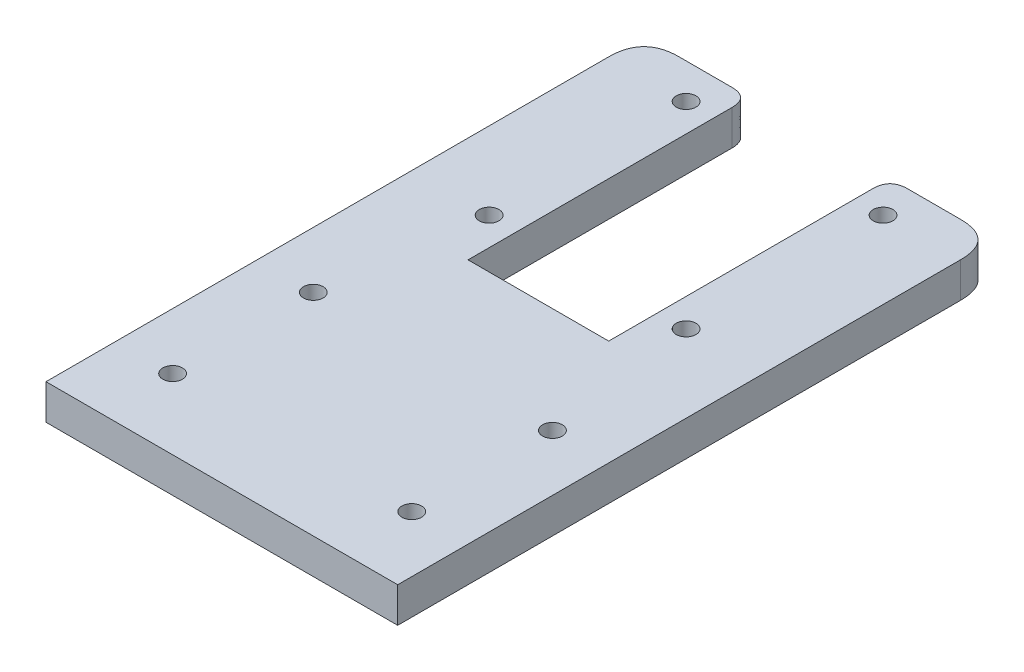
ISO-10303-21;
HEADER;
FILE_DESCRIPTION(('STEP AP214'),'2;1');
FILE_NAME('part.step','',(''),(''),'','','');
FILE_SCHEMA(('AUTOMOTIVE_DESIGN { 1 0 10303 214 1 1 1 1 }'));
ENDSEC;
DATA;
#1=APPLICATION_CONTEXT('core data for automotive mechanical design processes');
#2=APPLICATION_PROTOCOL_DEFINITION('international standard','automotive_design',2000,#1);
#3=PRODUCT_CONTEXT('',#1,'mechanical');
#4=PRODUCT('Part','Part','',(#3));
#5=PRODUCT_RELATED_PRODUCT_CATEGORY('part','',(#4));
#6=PRODUCT_DEFINITION_FORMATION('','',#4);
#7=PRODUCT_DEFINITION_CONTEXT('part definition',#1,'design');
#8=PRODUCT_DEFINITION('design','',#6,#7);
#9=PRODUCT_DEFINITION_SHAPE('','',#8);
#10=(LENGTH_UNIT() NAMED_UNIT(*) SI_UNIT(.MILLI.,.METRE.));
#11=(NAMED_UNIT(*) PLANE_ANGLE_UNIT() SI_UNIT($,.RADIAN.));
#12=(NAMED_UNIT(*) SI_UNIT($,.STERADIAN.) SOLID_ANGLE_UNIT());
#13=UNCERTAINTY_MEASURE_WITH_UNIT(LENGTH_MEASURE(1.E-05),#10,'distance_accuracy_value','');
#14=(GEOMETRIC_REPRESENTATION_CONTEXT(3) GLOBAL_UNCERTAINTY_ASSIGNED_CONTEXT((#13)) GLOBAL_UNIT_ASSIGNED_CONTEXT((#10,
#11,#12)) REPRESENTATION_CONTEXT('',''));
#15=CARTESIAN_POINT('',(0.,0.,0.));
#16=DIRECTION('',(0.,0.,1.));
#17=DIRECTION('',(1.,0.,0.));
#18=AXIS2_PLACEMENT_3D('',#15,#16,#17);
#19=CARTESIAN_POINT('',(25.,5.,-42.5));
#20=DIRECTION('',(0.,0.,1.));
#21=DIRECTION('',(1.,0.,0.));
#22=AXIS2_PLACEMENT_3D('',#19,#20,#21);
#23=PLANE('',#22);
#24=DIRECTION('',(-1.,0.,0.));
#25=VECTOR('',#24,1.);
#26=CARTESIAN_POINT('',(25.,5.,-42.5));
#27=LINE('',#26,#25);
#28=CARTESIAN_POINT('',(-12.5,5.,-42.5));
#29=VERTEX_POINT('',#28);
#30=CARTESIAN_POINT('',(-20.,5.,-42.5));
#31=VERTEX_POINT('',#30);
#32=EDGE_CURVE('E223',#29,#31,#27,.T.);
#33=ORIENTED_EDGE('',*,*,#32,.F.);
#34=CARTESIAN_POINT('',(-12.5,-0.25,-42.5));
#35=CARTESIAN_POINT('',(-12.5,1.58333333333333,-42.5));
#36=CARTESIAN_POINT('',(-12.5,3.41666666666667,-42.5));
#37=CARTESIAN_POINT('',(-12.5,5.25,-42.5));
#38=(BOUNDED_CURVE() B_SPLINE_CURVE(3,(#34,#35,#36,#37),.UNSPECIFIED.,.F.,
.F.) B_SPLINE_CURVE_WITH_KNOTS((4,4),(-0.00025,0.00525),
.UNSPECIFIED.) CURVE() GEOMETRIC_REPRESENTATION_ITEM() RATIONAL_B_SPLINE_CURVE((1.,1.,1.,1.)) REPRESENTATION_ITEM(''));
#39=CARTESIAN_POINT('',(-12.5,0.,-42.5));
#40=VERTEX_POINT('',#39);
#41=EDGE_CURVE('E703',#29,#40,#38,.F.);
#42=ORIENTED_EDGE('',*,*,#41,.T.);
#43=DIRECTION('',(-1.,0.,0.));
#44=VECTOR('',#43,1.);
#45=CARTESIAN_POINT('',(25.,0.,-42.5));
#46=LINE('',#45,#44);
#47=CARTESIAN_POINT('',(-20.,0.,-42.5));
#48=VERTEX_POINT('',#47);
#49=EDGE_CURVE('E567',#40,#48,#46,.T.);
#50=ORIENTED_EDGE('',*,*,#49,.T.);
#51=CARTESIAN_POINT('',(-20.,5.25,-42.5));
#52=CARTESIAN_POINT('',(-20.,3.41666666666666,-42.5));
#53=CARTESIAN_POINT('',(-20.,1.58333333333334,-42.5));
#54=CARTESIAN_POINT('',(-20.,-0.25,-42.5));
#55=(BOUNDED_CURVE() B_SPLINE_CURVE(3,(#51,#52,#53,#54),.UNSPECIFIED.,.F.,
.F.) B_SPLINE_CURVE_WITH_KNOTS((4,4),(-0.00025,0.00525),
.UNSPECIFIED.) CURVE() GEOMETRIC_REPRESENTATION_ITEM() RATIONAL_B_SPLINE_CURVE((1.,1.,1.,1.)) REPRESENTATION_ITEM(''));
#56=EDGE_CURVE('E475',#48,#31,#55,.F.);
#57=ORIENTED_EDGE('',*,*,#56,.T.);
#58=EDGE_LOOP('',(#33,#42,#50,#57));
#59=FACE_BOUND('',#58,.T.);
#60=ADVANCED_FACE('F48',(#59),#23,.F.);
#61=CARTESIAN_POINT('',(-25.,5.,42.5));
#62=DIRECTION('',(1.,0.,0.));
#63=DIRECTION('',(0.,0.,-1.));
#64=AXIS2_PLACEMENT_3D('',#61,#62,#63);
#65=PLANE('',#64);
#66=DIRECTION('',(0.,0.,1.));
#67=VECTOR('',#66,1.);
#68=CARTESIAN_POINT('',(-25.,5.,42.5));
#69=LINE('',#68,#67);
#70=CARTESIAN_POINT('',(-25.,5.,-37.5));
#71=VERTEX_POINT('',#70);
#72=CARTESIAN_POINT('',(-25.,5.,42.5));
#73=VERTEX_POINT('',#72);
#74=EDGE_CURVE('E509',#71,#73,#69,.T.);
#75=ORIENTED_EDGE('',*,*,#74,.F.);
#76=CARTESIAN_POINT('',(-25.,-0.25,-37.5));
#77=CARTESIAN_POINT('',(-25.,1.58333333333334,-37.5));
#78=CARTESIAN_POINT('',(-25.,3.41666666666666,-37.5));
#79=CARTESIAN_POINT('',(-25.,5.25,-37.5));
#80=(BOUNDED_CURVE() B_SPLINE_CURVE(3,(#76,#77,#78,#79),.UNSPECIFIED.,.F.,
.F.) B_SPLINE_CURVE_WITH_KNOTS((4,4),(-0.00025,0.00525),
.UNSPECIFIED.) CURVE() GEOMETRIC_REPRESENTATION_ITEM() RATIONAL_B_SPLINE_CURVE((1.,1.,1.,1.)) REPRESENTATION_ITEM(''));
#81=CARTESIAN_POINT('',(-25.,0.,-37.5));
#82=VERTEX_POINT('',#81);
#83=EDGE_CURVE('E486',#71,#82,#80,.F.);
#84=ORIENTED_EDGE('',*,*,#83,.T.);
#85=DIRECTION('',(0.,0.,1.));
#86=VECTOR('',#85,1.);
#87=CARTESIAN_POINT('',(-25.,0.,42.5));
#88=LINE('',#87,#86);
#89=CARTESIAN_POINT('',(-25.,0.,42.5));
#90=VERTEX_POINT('',#89);
#91=EDGE_CURVE('E504',#82,#90,#88,.T.);
#92=ORIENTED_EDGE('',*,*,#91,.T.);
#93=DIRECTION('',(0.,-1.,0.));
#94=VECTOR('',#93,1.);
#95=CARTESIAN_POINT('',(-25.,5.,42.5));
#96=LINE('',#95,#94);
#97=EDGE_CURVE('E490',#73,#90,#96,.T.);
#98=ORIENTED_EDGE('',*,*,#97,.F.);
#99=EDGE_LOOP('',(#75,#84,#92,#98));
#100=FACE_BOUND('',#99,.T.);
#101=ADVANCED_FACE('F433',(#100),#65,.F.);
#102=CARTESIAN_POINT('',(25.,5.,42.5));
#103=DIRECTION('',(0.,0.,-1.));
#104=DIRECTION('',(-1.,0.,0.));
#105=AXIS2_PLACEMENT_3D('',#102,#103,#104);
#106=PLANE('',#105);
#107=DIRECTION('',(1.,0.,0.));
#108=VECTOR('',#107,1.);
#109=CARTESIAN_POINT('',(25.,0.,42.5));
#110=LINE('',#109,#108);
#111=CARTESIAN_POINT('',(25.,0.,42.5));
#112=VERTEX_POINT('',#111);
#113=EDGE_CURVE('E507',#90,#112,#110,.T.);
#114=ORIENTED_EDGE('',*,*,#113,.T.);
#115=DIRECTION('',(0.,-1.,0.));
#116=VECTOR('',#115,1.);
#117=CARTESIAN_POINT('',(25.,5.,42.5));
#118=LINE('',#117,#116);
#119=CARTESIAN_POINT('',(25.,5.,42.5));
#120=VERTEX_POINT('',#119);
#121=EDGE_CURVE('E247',#120,#112,#118,.T.);
#122=ORIENTED_EDGE('',*,*,#121,.F.);
#123=DIRECTION('',(1.,0.,0.));
#124=VECTOR('',#123,1.);
#125=CARTESIAN_POINT('',(25.,5.,42.5));
#126=LINE('',#125,#124);
#127=EDGE_CURVE('E512',#73,#120,#126,.T.);
#128=ORIENTED_EDGE('',*,*,#127,.F.);
#129=ORIENTED_EDGE('',*,*,#97,.T.);
#130=EDGE_LOOP('',(#114,#122,#128,#129));
#131=FACE_BOUND('',#130,.T.);
#132=ADVANCED_FACE('F755',(#131),#106,.F.);
#133=CARTESIAN_POINT('',(25.,5.,42.5));
#134=DIRECTION('',(-1.,0.,0.));
#135=DIRECTION('',(0.,0.,1.));
#136=AXIS2_PLACEMENT_3D('',#133,#134,#135);
#137=PLANE('',#136);
#138=DIRECTION('',(0.,0.,-1.));
#139=VECTOR('',#138,1.);
#140=CARTESIAN_POINT('',(25.,0.,42.5));
#141=LINE('',#140,#139);
#142=CARTESIAN_POINT('',(25.,0.,-37.5));
#143=VERTEX_POINT('',#142);
#144=EDGE_CURVE('E263',#112,#143,#141,.T.);
#145=ORIENTED_EDGE('',*,*,#144,.T.);
#146=CARTESIAN_POINT('',(25.,5.25,-37.5));
#147=CARTESIAN_POINT('',(25.,3.41666666666666,-37.5));
#148=CARTESIAN_POINT('',(25.,1.58333333333334,-37.5));
#149=CARTESIAN_POINT('',(25.,-0.25,-37.5));
#150=(BOUNDED_CURVE() B_SPLINE_CURVE(3,(#146,#147,#148,#149),.UNSPECIFIED.,.F.,
.F.) B_SPLINE_CURVE_WITH_KNOTS((4,4),(-0.00025,0.00525),
.UNSPECIFIED.) CURVE() GEOMETRIC_REPRESENTATION_ITEM() RATIONAL_B_SPLINE_CURVE((1.,1.,1.,1.)) REPRESENTATION_ITEM(''));
#151=CARTESIAN_POINT('',(25.,5.,-37.5));
#152=VERTEX_POINT('',#151);
#153=EDGE_CURVE('E533',#143,#152,#150,.F.);
#154=ORIENTED_EDGE('',*,*,#153,.T.);
#155=DIRECTION('',(0.,0.,-1.));
#156=VECTOR('',#155,1.);
#157=CARTESIAN_POINT('',(25.,5.,42.5));
#158=LINE('',#157,#156);
#159=EDGE_CURVE('E233',#120,#152,#158,.T.);
#160=ORIENTED_EDGE('',*,*,#159,.F.);
#161=ORIENTED_EDGE('',*,*,#121,.T.);
#162=EDGE_LOOP('',(#145,#154,#160,#161));
#163=FACE_BOUND('',#162,.T.);
#164=ADVANCED_FACE('F277',(#163),#137,.F.);
#165=CARTESIAN_POINT('',(20.,0.,-42.5));
#166=VERTEX_POINT('',#165);
#167=CARTESIAN_POINT('',(12.5,0.,-42.5));
#168=VERTEX_POINT('',#167);
#169=EDGE_CURVE('E248',#166,#168,#46,.T.);
#170=ORIENTED_EDGE('',*,*,#169,.T.);
#171=CARTESIAN_POINT('',(12.5,5.25,-42.5));
#172=CARTESIAN_POINT('',(12.5,3.41666666666667,-42.5));
#173=CARTESIAN_POINT('',(12.5,1.58333333333333,-42.5));
#174=CARTESIAN_POINT('',(12.5,-0.25,-42.5));
#175=(BOUNDED_CURVE() B_SPLINE_CURVE(3,(#171,#172,#173,#174),.UNSPECIFIED.,.F.,
.F.) B_SPLINE_CURVE_WITH_KNOTS((4,4),(-0.00525,0.00025),
.UNSPECIFIED.) CURVE() GEOMETRIC_REPRESENTATION_ITEM() RATIONAL_B_SPLINE_CURVE((1.,1.,1.,1.)) REPRESENTATION_ITEM(''));
#176=CARTESIAN_POINT('',(12.5,5.,-42.5));
#177=VERTEX_POINT('',#176);
#178=EDGE_CURVE('E696',#168,#177,#175,.F.);
#179=ORIENTED_EDGE('',*,*,#178,.T.);
#180=CARTESIAN_POINT('',(20.,5.,-42.5));
#181=VERTEX_POINT('',#180);
#182=EDGE_CURVE('E232',#181,#177,#27,.T.);
#183=ORIENTED_EDGE('',*,*,#182,.F.);
#184=CARTESIAN_POINT('',(20.,-0.25,-42.5));
#185=CARTESIAN_POINT('',(20.,1.58333333333334,-42.5));
#186=CARTESIAN_POINT('',(20.,3.41666666666666,-42.5));
#187=CARTESIAN_POINT('',(20.,5.25,-42.5));
#188=(BOUNDED_CURVE() B_SPLINE_CURVE(3,(#184,#185,#186,#187),.UNSPECIFIED.,.F.,
.F.) B_SPLINE_CURVE_WITH_KNOTS((4,4),(-0.00025,0.00525),
.UNSPECIFIED.) CURVE() GEOMETRIC_REPRESENTATION_ITEM() RATIONAL_B_SPLINE_CURVE((1.,1.,1.,1.)) REPRESENTATION_ITEM(''));
#189=EDGE_CURVE('E257',#181,#166,#188,.F.);
#190=ORIENTED_EDGE('',*,*,#189,.T.);
#191=EDGE_LOOP('',(#170,#179,#183,#190));
#192=FACE_BOUND('',#191,.T.);
#193=ADVANCED_FACE('F266',(#192),#23,.F.);
#194=CARTESIAN_POINT('',(0.,5.,0.));
#195=DIRECTION('',(0.,1.,0.));
#196=DIRECTION('',(0.,0.,1.));
#197=AXIS2_PLACEMENT_3D('',#194,#195,#196);
#198=PLANE('',#197);
#199=CARTESIAN_POINT('',(-17.,5.,12.5));
#200=DIRECTION('',(0.,1.,0.));
#201=DIRECTION('',(0.,0.,-1.));
#202=AXIS2_PLACEMENT_3D('',#199,#200,#201);
#203=CIRCLE('',#202,1.4);
#204=CARTESIAN_POINT('',(-17.,5.,11.1));
#205=VERTEX_POINT('',#204);
#206=EDGE_CURVE('E616',#205,#205,#203,.T.);
#207=ORIENTED_EDGE('',*,*,#206,.F.);
#208=EDGE_LOOP('',(#207));
#209=FACE_BOUND('',#208,.T.);
#210=CARTESIAN_POINT('',(17.,5.,12.5));
#211=DIRECTION('',(0.,1.,0.));
#212=DIRECTION('',(0.,0.,1.));
#213=AXIS2_PLACEMENT_3D('',#210,#211,#212);
#214=CIRCLE('',#213,1.4);
#215=CARTESIAN_POINT('',(17.,5.,13.9));
#216=VERTEX_POINT('',#215);
#217=EDGE_CURVE('E624',#216,#216,#214,.T.);
#218=ORIENTED_EDGE('',*,*,#217,.F.);
#219=EDGE_LOOP('',(#218));
#220=FACE_BOUND('',#219,.T.);
#221=CARTESIAN_POINT('',(17.,5.,32.5));
#222=DIRECTION('',(0.,1.,0.));
#223=DIRECTION('',(0.,0.,-1.));
#224=AXIS2_PLACEMENT_3D('',#221,#222,#223);
#225=CIRCLE('',#224,1.4);
#226=CARTESIAN_POINT('',(17.,5.,31.1));
#227=VERTEX_POINT('',#226);
#228=EDGE_CURVE('E610',#227,#227,#225,.T.);
#229=ORIENTED_EDGE('',*,*,#228,.F.);
#230=EDGE_LOOP('',(#229));
#231=FACE_BOUND('',#230,.T.);
#232=CARTESIAN_POINT('',(-17.,5.,32.5));
#233=DIRECTION('',(0.,1.,0.));
#234=DIRECTION('',(0.,0.,1.));
#235=AXIS2_PLACEMENT_3D('',#232,#233,#234);
#236=CIRCLE('',#235,1.4);
#237=CARTESIAN_POINT('',(-17.,5.,33.9));
#238=VERTEX_POINT('',#237);
#239=EDGE_CURVE('E604',#238,#238,#236,.T.);
#240=ORIENTED_EDGE('',*,*,#239,.F.);
#241=EDGE_LOOP('',(#240));
#242=FACE_BOUND('',#241,.T.);
#243=ORIENTED_EDGE('',*,*,#182,.T.);
#244=CARTESIAN_POINT('',(10.,5.,-40.));
#245=CARTESIAN_POINT('',(10.,5.,-42.5));
#246=CARTESIAN_POINT('',(12.5,5.,-42.5));
#247=(BOUNDED_CURVE() B_SPLINE_CURVE(2,(#244,#245,#246),.UNSPECIFIED.,.F.,
.F.) B_SPLINE_CURVE_WITH_KNOTS((3,3),(0.,1.),
.UNSPECIFIED.) CURVE() GEOMETRIC_REPRESENTATION_ITEM() RATIONAL_B_SPLINE_CURVE((1.,1.,1.)) REPRESENTATION_ITEM(''));
#248=CARTESIAN_POINT('',(10.,5.,-40.));
#249=VERTEX_POINT('',#248);
#250=EDGE_CURVE('E78',#177,#249,#247,.F.);
#251=ORIENTED_EDGE('',*,*,#250,.T.);
#252=DIRECTION('',(0.,0.,-1.));
#253=VECTOR('',#252,1.);
#254=CARTESIAN_POINT('',(10.,5.,-2.50000000000001));
#255=LINE('',#254,#253);
#256=CARTESIAN_POINT('',(10.,5.,-2.50000000000001));
#257=VERTEX_POINT('',#256);
#258=EDGE_CURVE('E159',#257,#249,#255,.T.);
#259=ORIENTED_EDGE('',*,*,#258,.F.);
#260=DIRECTION('',(1.,0.,0.));
#261=VECTOR('',#260,1.);
#262=CARTESIAN_POINT('',(10.,5.,-2.50000000000001));
#263=LINE('',#262,#261);
#264=CARTESIAN_POINT('',(-9.99999999999999,5.,-2.50000000000001));
#265=VERTEX_POINT('',#264);
#266=EDGE_CURVE('E599',#265,#257,#263,.T.);
#267=ORIENTED_EDGE('',*,*,#266,.F.);
#268=DIRECTION('',(0.,0.,1.));
#269=VECTOR('',#268,1.);
#270=CARTESIAN_POINT('',(-9.99999999999999,5.,-2.50000000000001));
#271=LINE('',#270,#269);
#272=CARTESIAN_POINT('',(-9.99999999999999,5.,-40.));
#273=VERTEX_POINT('',#272);
#274=EDGE_CURVE('E165',#273,#265,#271,.T.);
#275=ORIENTED_EDGE('',*,*,#274,.F.);
#276=CARTESIAN_POINT('',(-12.5,5.,-42.5));
#277=CARTESIAN_POINT('',(-9.99999999999999,5.,-42.5));
#278=CARTESIAN_POINT('',(-9.99999999999999,5.,-40.));
#279=(BOUNDED_CURVE() B_SPLINE_CURVE(2,(#276,#277,#278),.UNSPECIFIED.,.F.,
.F.) B_SPLINE_CURVE_WITH_KNOTS((3,3),(0.,1.),
.UNSPECIFIED.) CURVE() GEOMETRIC_REPRESENTATION_ITEM() RATIONAL_B_SPLINE_CURVE((1.,1.,1.)) REPRESENTATION_ITEM(''));
#280=EDGE_CURVE('E312',#273,#29,#279,.F.);
#281=ORIENTED_EDGE('',*,*,#280,.T.);
#282=ORIENTED_EDGE('',*,*,#32,.T.);
#283=CARTESIAN_POINT('',(-25.,5.,-37.5));
#284=CARTESIAN_POINT('',(-25.,5.,-42.5));
#285=CARTESIAN_POINT('',(-20.,5.,-42.5));
#286=(BOUNDED_CURVE() B_SPLINE_CURVE(2,(#283,#284,#285),.UNSPECIFIED.,.F.,
.F.) B_SPLINE_CURVE_WITH_KNOTS((3,3),(0.,1.),
.UNSPECIFIED.) CURVE() GEOMETRIC_REPRESENTATION_ITEM() RATIONAL_B_SPLINE_CURVE((1.,1.,1.)) REPRESENTATION_ITEM(''));
#287=EDGE_CURVE('E480',#31,#71,#286,.F.);
#288=ORIENTED_EDGE('',*,*,#287,.T.);
#289=ORIENTED_EDGE('',*,*,#74,.T.);
#290=ORIENTED_EDGE('',*,*,#127,.T.);
#291=ORIENTED_EDGE('',*,*,#159,.T.);
#292=CARTESIAN_POINT('',(20.,5.,-42.5));
#293=CARTESIAN_POINT('',(25.,5.,-42.5));
#294=CARTESIAN_POINT('',(25.,5.,-37.5));
#295=(BOUNDED_CURVE() B_SPLINE_CURVE(2,(#292,#293,#294),.UNSPECIFIED.,.F.,
.F.) B_SPLINE_CURVE_WITH_KNOTS((3,3),(0.,1.),
.UNSPECIFIED.) CURVE() GEOMETRIC_REPRESENTATION_ITEM() RATIONAL_B_SPLINE_CURVE((1.,1.,1.)) REPRESENTATION_ITEM(''));
#296=EDGE_CURVE('E543',#152,#181,#295,.F.);
#297=ORIENTED_EDGE('',*,*,#296,.T.);
#298=EDGE_LOOP('',(#243,#251,#259,#267,#275,#281,#282,#288,#289,#290,#291,#297));
#299=FACE_BOUND('',#298,.T.);
#300=CARTESIAN_POINT('',(14.,5.,-37.5));
#301=DIRECTION('',(0.,1.,0.));
#302=DIRECTION('',(0.,0.,-1.));
#303=AXIS2_PLACEMENT_3D('',#300,#301,#302);
#304=CIRCLE('',#303,1.4);
#305=CARTESIAN_POINT('',(14.,5.,-38.9));
#306=VERTEX_POINT('',#305);
#307=EDGE_CURVE('E644',#306,#306,#304,.T.);
#308=ORIENTED_EDGE('',*,*,#307,.F.);
#309=EDGE_LOOP('',(#308));
#310=FACE_BOUND('',#309,.T.);
#311=CARTESIAN_POINT('',(-14.,5.,-9.50000000000001));
#312=DIRECTION('',(0.,1.,0.));
#313=DIRECTION('',(0.,0.,1.));
#314=AXIS2_PLACEMENT_3D('',#311,#312,#313);
#315=CIRCLE('',#314,1.4);
#316=CARTESIAN_POINT('',(-14.,5.,-8.10000000000001));
#317=VERTEX_POINT('',#316);
#318=EDGE_CURVE('E648',#317,#317,#315,.T.);
#319=ORIENTED_EDGE('',*,*,#318,.F.);
#320=EDGE_LOOP('',(#319));
#321=FACE_BOUND('',#320,.T.);
#322=CARTESIAN_POINT('',(14.,5.,-9.50000000000002));
#323=DIRECTION('',(0.,1.,0.));
#324=DIRECTION('',(0.,0.,-1.));
#325=AXIS2_PLACEMENT_3D('',#322,#323,#324);
#326=CIRCLE('',#325,1.4);
#327=CARTESIAN_POINT('',(14.,5.,-10.9));
#328=VERTEX_POINT('',#327);
#329=EDGE_CURVE('E652',#328,#328,#326,.T.);
#330=ORIENTED_EDGE('',*,*,#329,.F.);
#331=EDGE_LOOP('',(#330));
#332=FACE_BOUND('',#331,.T.);
#333=CARTESIAN_POINT('',(-14.,5.,-37.5));
#334=DIRECTION('',(0.,1.,0.));
#335=DIRECTION('',(0.,0.,1.));
#336=AXIS2_PLACEMENT_3D('',#333,#334,#335);
#337=CIRCLE('',#336,1.4);
#338=CARTESIAN_POINT('',(-14.,5.,-36.1));
#339=VERTEX_POINT('',#338);
#340=EDGE_CURVE('E516',#339,#339,#337,.T.);
#341=ORIENTED_EDGE('',*,*,#340,.F.);
#342=EDGE_LOOP('',(#341));
#343=FACE_BOUND('',#342,.T.);
#344=ADVANCED_FACE('F276',(#209,#220,#231,#242,#299,#310,#321,#332,#343),#198,.T.);
#345=CARTESIAN_POINT('',(0.,0.,0.));
#346=DIRECTION('',(0.,1.,0.));
#347=DIRECTION('',(0.,0.,1.));
#348=AXIS2_PLACEMENT_3D('',#345,#346,#347);
#349=PLANE('',#348);
#350=CARTESIAN_POINT('',(-17.,0.,12.5));
#351=DIRECTION('',(0.,1.,0.));
#352=DIRECTION('',(0.,0.,-1.));
#353=AXIS2_PLACEMENT_3D('',#350,#351,#352);
#354=CIRCLE('',#353,1.4);
#355=CARTESIAN_POINT('',(-17.,0.,11.1));
#356=VERTEX_POINT('',#355);
#357=EDGE_CURVE('E612',#356,#356,#354,.T.);
#358=ORIENTED_EDGE('',*,*,#357,.T.);
#359=EDGE_LOOP('',(#358));
#360=FACE_BOUND('',#359,.T.);
#361=CARTESIAN_POINT('',(17.,0.,12.5));
#362=DIRECTION('',(0.,1.,0.));
#363=DIRECTION('',(0.,0.,1.));
#364=AXIS2_PLACEMENT_3D('',#361,#362,#363);
#365=CIRCLE('',#364,1.4);
#366=CARTESIAN_POINT('',(17.,0.,13.9));
#367=VERTEX_POINT('',#366);
#368=EDGE_CURVE('E620',#367,#367,#365,.T.);
#369=ORIENTED_EDGE('',*,*,#368,.T.);
#370=EDGE_LOOP('',(#369));
#371=FACE_BOUND('',#370,.T.);
#372=CARTESIAN_POINT('',(17.,0.,32.5));
#373=DIRECTION('',(0.,1.,0.));
#374=DIRECTION('',(0.,0.,-1.));
#375=AXIS2_PLACEMENT_3D('',#372,#373,#374);
#376=CIRCLE('',#375,1.4);
#377=CARTESIAN_POINT('',(17.,0.,31.1));
#378=VERTEX_POINT('',#377);
#379=EDGE_CURVE('E628',#378,#378,#376,.T.);
#380=ORIENTED_EDGE('',*,*,#379,.T.);
#381=EDGE_LOOP('',(#380));
#382=FACE_BOUND('',#381,.T.);
#383=CARTESIAN_POINT('',(-17.,0.,32.5));
#384=DIRECTION('',(0.,1.,0.));
#385=DIRECTION('',(0.,0.,1.));
#386=AXIS2_PLACEMENT_3D('',#383,#384,#385);
#387=CIRCLE('',#386,1.4);
#388=CARTESIAN_POINT('',(-17.,0.,33.9));
#389=VERTEX_POINT('',#388);
#390=EDGE_CURVE('E600',#389,#389,#387,.T.);
#391=ORIENTED_EDGE('',*,*,#390,.T.);
#392=EDGE_LOOP('',(#391));
#393=FACE_BOUND('',#392,.T.);
#394=DIRECTION('',(0.,0.,-1.));
#395=VECTOR('',#394,1.);
#396=CARTESIAN_POINT('',(10.,0.,-2.50000000000001));
#397=LINE('',#396,#395);
#398=CARTESIAN_POINT('',(10.,0.,-2.50000000000001));
#399=VERTEX_POINT('',#398);
#400=CARTESIAN_POINT('',(10.,0.,-40.));
#401=VERTEX_POINT('',#400);
#402=EDGE_CURVE('E171',#399,#401,#397,.T.);
#403=ORIENTED_EDGE('',*,*,#402,.T.);
#404=CARTESIAN_POINT('',(12.5,0.,-42.5));
#405=CARTESIAN_POINT('',(10.,0.,-42.5));
#406=CARTESIAN_POINT('',(10.,0.,-40.));
#407=(BOUNDED_CURVE() B_SPLINE_CURVE(2,(#404,#405,#406),.UNSPECIFIED.,.F.,
.F.) B_SPLINE_CURVE_WITH_KNOTS((3,3),(0.,1.),
.UNSPECIFIED.) CURVE() GEOMETRIC_REPRESENTATION_ITEM() RATIONAL_B_SPLINE_CURVE((1.,1.,1.)) REPRESENTATION_ITEM(''));
#408=EDGE_CURVE('E12',#401,#168,#407,.F.);
#409=ORIENTED_EDGE('',*,*,#408,.T.);
#410=ORIENTED_EDGE('',*,*,#169,.F.);
#411=CARTESIAN_POINT('',(25.,0.,-37.5));
#412=CARTESIAN_POINT('',(25.,0.,-42.5));
#413=CARTESIAN_POINT('',(20.,0.,-42.5));
#414=(BOUNDED_CURVE() B_SPLINE_CURVE(2,(#411,#412,#413),.UNSPECIFIED.,.F.,
.F.) B_SPLINE_CURVE_WITH_KNOTS((3,3),(0.,1.),
.UNSPECIFIED.) CURVE() GEOMETRIC_REPRESENTATION_ITEM() RATIONAL_B_SPLINE_CURVE((1.,1.,1.)) REPRESENTATION_ITEM(''));
#415=EDGE_CURVE('E583',#166,#143,#414,.F.);
#416=ORIENTED_EDGE('',*,*,#415,.T.);
#417=ORIENTED_EDGE('',*,*,#144,.F.);
#418=ORIENTED_EDGE('',*,*,#113,.F.);
#419=ORIENTED_EDGE('',*,*,#91,.F.);
#420=CARTESIAN_POINT('',(-20.,0.,-42.5));
#421=CARTESIAN_POINT('',(-25.,0.,-42.5));
#422=CARTESIAN_POINT('',(-25.,0.,-37.5));
#423=(BOUNDED_CURVE() B_SPLINE_CURVE(2,(#420,#421,#422),.UNSPECIFIED.,.F.,
.F.) B_SPLINE_CURVE_WITH_KNOTS((3,3),(0.,1.),
.UNSPECIFIED.) CURVE() GEOMETRIC_REPRESENTATION_ITEM() RATIONAL_B_SPLINE_CURVE((1.,1.,1.)) REPRESENTATION_ITEM(''));
#424=EDGE_CURVE('E478',#82,#48,#423,.F.);
#425=ORIENTED_EDGE('',*,*,#424,.T.);
#426=ORIENTED_EDGE('',*,*,#49,.F.);
#427=CARTESIAN_POINT('',(-9.99999999999999,0.,-40.));
#428=CARTESIAN_POINT('',(-9.99999999999999,0.,-42.5));
#429=CARTESIAN_POINT('',(-12.5,0.,-42.5));
#430=(BOUNDED_CURVE() B_SPLINE_CURVE(2,(#427,#428,#429),.UNSPECIFIED.,.F.,
.F.) B_SPLINE_CURVE_WITH_KNOTS((3,3),(0.,1.),
.UNSPECIFIED.) CURVE() GEOMETRIC_REPRESENTATION_ITEM() RATIONAL_B_SPLINE_CURVE((1.,1.,1.)) REPRESENTATION_ITEM(''));
#431=CARTESIAN_POINT('',(-9.99999999999999,0.,-40.));
#432=VERTEX_POINT('',#431);
#433=EDGE_CURVE('E153',#40,#432,#430,.F.);
#434=ORIENTED_EDGE('',*,*,#433,.T.);
#435=DIRECTION('',(0.,0.,1.));
#436=VECTOR('',#435,1.);
#437=CARTESIAN_POINT('',(-9.99999999999999,0.,-2.50000000000001));
#438=LINE('',#437,#436);
#439=CARTESIAN_POINT('',(-9.99999999999999,0.,-2.50000000000001));
#440=VERTEX_POINT('',#439);
#441=EDGE_CURVE('E145',#432,#440,#438,.T.);
#442=ORIENTED_EDGE('',*,*,#441,.T.);
#443=DIRECTION('',(1.,0.,0.));
#444=VECTOR('',#443,1.);
#445=CARTESIAN_POINT('',(10.,0.,-2.50000000000001));
#446=LINE('',#445,#444);
#447=EDGE_CURVE('E150',#440,#399,#446,.T.);
#448=ORIENTED_EDGE('',*,*,#447,.T.);
#449=EDGE_LOOP('',(#403,#409,#410,#416,#417,#418,#419,#425,#426,#434,#442,#448));
#450=FACE_BOUND('',#449,.T.);
#451=CARTESIAN_POINT('',(14.,0.,-37.5));
#452=DIRECTION('',(0.,1.,0.));
#453=DIRECTION('',(0.,0.,-1.));
#454=AXIS2_PLACEMENT_3D('',#451,#452,#453);
#455=CIRCLE('',#454,1.4);
#456=CARTESIAN_POINT('',(14.,0.,-38.9));
#457=VERTEX_POINT('',#456);
#458=EDGE_CURVE('E660',#457,#457,#455,.T.);
#459=ORIENTED_EDGE('',*,*,#458,.T.);
#460=EDGE_LOOP('',(#459));
#461=FACE_BOUND('',#460,.T.);
#462=CARTESIAN_POINT('',(-14.,0.,-9.50000000000001));
#463=DIRECTION('',(0.,1.,0.));
#464=DIRECTION('',(0.,0.,1.));
#465=AXIS2_PLACEMENT_3D('',#462,#463,#464);
#466=CIRCLE('',#465,1.4);
#467=CARTESIAN_POINT('',(-14.,0.,-8.10000000000001));
#468=VERTEX_POINT('',#467);
#469=EDGE_CURVE('E672',#468,#468,#466,.T.);
#470=ORIENTED_EDGE('',*,*,#469,.T.);
#471=EDGE_LOOP('',(#470));
#472=FACE_BOUND('',#471,.T.);
#473=CARTESIAN_POINT('',(14.,0.,-9.50000000000002));
#474=DIRECTION('',(0.,1.,0.));
#475=DIRECTION('',(0.,0.,-1.));
#476=AXIS2_PLACEMENT_3D('',#473,#474,#475);
#477=CIRCLE('',#476,1.4);
#478=CARTESIAN_POINT('',(14.,0.,-10.9));
#479=VERTEX_POINT('',#478);
#480=EDGE_CURVE('E667',#479,#479,#477,.T.);
#481=ORIENTED_EDGE('',*,*,#480,.T.);
#482=EDGE_LOOP('',(#481));
#483=FACE_BOUND('',#482,.T.);
#484=CARTESIAN_POINT('',(-14.,0.,-37.5));
#485=DIRECTION('',(0.,1.,0.));
#486=DIRECTION('',(0.,0.,1.));
#487=AXIS2_PLACEMENT_3D('',#484,#485,#486);
#488=CIRCLE('',#487,1.4);
#489=CARTESIAN_POINT('',(-14.,0.,-36.1));
#490=VERTEX_POINT('',#489);
#491=EDGE_CURVE('E508',#490,#490,#488,.T.);
#492=ORIENTED_EDGE('',*,*,#491,.T.);
#493=EDGE_LOOP('',(#492));
#494=FACE_BOUND('',#493,.T.);
#495=ADVANCED_FACE('F147',(#360,#371,#382,#393,#450,#461,#472,#483,#494),#349,.F.);
#496=CARTESIAN_POINT('',(-14.,0.,-37.5));
#497=DIRECTION('',(0.,1.,0.));
#498=DIRECTION('',(0.,0.,1.));
#499=AXIS2_PLACEMENT_3D('',#496,#497,#498);
#500=CYLINDRICAL_SURFACE('',#499,1.4);
#501=ORIENTED_EDGE('',*,*,#491,.F.);
#502=EDGE_LOOP('',(#501));
#503=FACE_BOUND('',#502,.T.);
#504=ORIENTED_EDGE('',*,*,#340,.T.);
#505=EDGE_LOOP('',(#504));
#506=FACE_BOUND('',#505,.T.);
#507=ADVANCED_FACE('F557',(#503,#506),#500,.F.);
#508=CARTESIAN_POINT('',(14.,0.,-9.50000000000002));
#509=DIRECTION('',(0.,1.,0.));
#510=DIRECTION('',(0.,0.,1.));
#511=AXIS2_PLACEMENT_3D('',#508,#509,#510);
#512=CYLINDRICAL_SURFACE('',#511,1.4);
#513=ORIENTED_EDGE('',*,*,#480,.F.);
#514=EDGE_LOOP('',(#513));
#515=FACE_BOUND('',#514,.T.);
#516=ORIENTED_EDGE('',*,*,#329,.T.);
#517=EDGE_LOOP('',(#516));
#518=FACE_BOUND('',#517,.T.);
#519=ADVANCED_FACE('F216',(#515,#518),#512,.F.);
#520=CARTESIAN_POINT('',(-14.,0.,-9.50000000000001));
#521=DIRECTION('',(0.,1.,0.));
#522=DIRECTION('',(0.,0.,1.));
#523=AXIS2_PLACEMENT_3D('',#520,#521,#522);
#524=CYLINDRICAL_SURFACE('',#523,1.4);
#525=ORIENTED_EDGE('',*,*,#469,.F.);
#526=EDGE_LOOP('',(#525));
#527=FACE_BOUND('',#526,.T.);
#528=ORIENTED_EDGE('',*,*,#318,.T.);
#529=EDGE_LOOP('',(#528));
#530=FACE_BOUND('',#529,.T.);
#531=ADVANCED_FACE('F793',(#527,#530),#524,.F.);
#532=CARTESIAN_POINT('',(14.,0.,-37.5));
#533=DIRECTION('',(0.,1.,0.));
#534=DIRECTION('',(0.,0.,1.));
#535=AXIS2_PLACEMENT_3D('',#532,#533,#534);
#536=CYLINDRICAL_SURFACE('',#535,1.4);
#537=ORIENTED_EDGE('',*,*,#458,.F.);
#538=EDGE_LOOP('',(#537));
#539=FACE_BOUND('',#538,.T.);
#540=ORIENTED_EDGE('',*,*,#307,.T.);
#541=EDGE_LOOP('',(#540));
#542=FACE_BOUND('',#541,.T.);
#543=ADVANCED_FACE('F215',(#539,#542),#536,.F.);
#544=CARTESIAN_POINT('',(-9.99999999999999,0.,-2.50000000000001));
#545=DIRECTION('',(-1.,0.,0.));
#546=DIRECTION('',(0.,0.,1.));
#547=AXIS2_PLACEMENT_3D('',#544,#545,#546);
#548=PLANE('',#547);
#549=ORIENTED_EDGE('',*,*,#441,.F.);
#550=CARTESIAN_POINT('',(-9.99999999999999,5.25,-40.));
#551=CARTESIAN_POINT('',(-9.99999999999999,3.41666666666667,-40.));
#552=CARTESIAN_POINT('',(-9.99999999999999,1.58333333333333,-40.));
#553=CARTESIAN_POINT('',(-9.99999999999999,-0.25,-40.));
#554=(BOUNDED_CURVE() B_SPLINE_CURVE(3,(#550,#551,#552,#553),.UNSPECIFIED.,.F.,
.F.) B_SPLINE_CURVE_WITH_KNOTS((4,4),(-0.00025,0.00525),
.UNSPECIFIED.) CURVE() GEOMETRIC_REPRESENTATION_ITEM() RATIONAL_B_SPLINE_CURVE((1.,1.,1.,1.)) REPRESENTATION_ITEM(''));
#555=EDGE_CURVE('E706',#432,#273,#554,.F.);
#556=ORIENTED_EDGE('',*,*,#555,.T.);
#557=ORIENTED_EDGE('',*,*,#274,.T.);
#558=DIRECTION('',(0.,1.,0.));
#559=VECTOR('',#558,1.);
#560=CARTESIAN_POINT('',(-9.99999999999999,0.,-2.50000000000001));
#561=LINE('',#560,#559);
#562=EDGE_CURVE('E162',#440,#265,#561,.T.);
#563=ORIENTED_EDGE('',*,*,#562,.F.);
#564=EDGE_LOOP('',(#549,#556,#557,#563));
#565=FACE_BOUND('',#564,.T.);
#566=ADVANCED_FACE('F163',(#565),#548,.F.);
#567=CARTESIAN_POINT('',(10.,0.,-2.50000000000001));
#568=DIRECTION('',(1.,0.,0.));
#569=DIRECTION('',(0.,0.,-1.));
#570=AXIS2_PLACEMENT_3D('',#567,#568,#569);
#571=PLANE('',#570);
#572=ORIENTED_EDGE('',*,*,#258,.T.);
#573=CARTESIAN_POINT('',(10.,-0.25,-40.));
#574=CARTESIAN_POINT('',(10.,1.58333333333333,-40.));
#575=CARTESIAN_POINT('',(10.,3.41666666666667,-40.));
#576=CARTESIAN_POINT('',(10.,5.25,-40.));
#577=(BOUNDED_CURVE() B_SPLINE_CURVE(3,(#573,#574,#575,#576),.UNSPECIFIED.,.F.,
.F.) B_SPLINE_CURVE_WITH_KNOTS((4,4),(-0.00525,0.00025),
.UNSPECIFIED.) CURVE() GEOMETRIC_REPRESENTATION_ITEM() RATIONAL_B_SPLINE_CURVE((1.,1.,1.,1.)) REPRESENTATION_ITEM(''));
#578=EDGE_CURVE('E63',#249,#401,#577,.F.);
#579=ORIENTED_EDGE('',*,*,#578,.T.);
#580=ORIENTED_EDGE('',*,*,#402,.F.);
#581=DIRECTION('',(0.,1.,0.));
#582=VECTOR('',#581,1.);
#583=CARTESIAN_POINT('',(10.,0.,-2.50000000000001));
#584=LINE('',#583,#582);
#585=EDGE_CURVE('E170',#399,#257,#584,.T.);
#586=ORIENTED_EDGE('',*,*,#585,.T.);
#587=EDGE_LOOP('',(#572,#579,#580,#586));
#588=FACE_BOUND('',#587,.T.);
#589=ADVANCED_FACE('F197',(#588),#571,.F.);
#590=CARTESIAN_POINT('',(10.,0.,-2.50000000000001));
#591=DIRECTION('',(0.,0.,1.));
#592=DIRECTION('',(1.,0.,0.));
#593=AXIS2_PLACEMENT_3D('',#590,#591,#592);
#594=PLANE('',#593);
#595=ORIENTED_EDGE('',*,*,#266,.T.);
#596=ORIENTED_EDGE('',*,*,#585,.F.);
#597=ORIENTED_EDGE('',*,*,#447,.F.);
#598=ORIENTED_EDGE('',*,*,#562,.T.);
#599=EDGE_LOOP('',(#595,#596,#597,#598));
#600=FACE_BOUND('',#599,.T.);
#601=ADVANCED_FACE('F174',(#600),#594,.F.);
#602=CARTESIAN_POINT('',(-25.,5.25,-37.5));
#603=CARTESIAN_POINT('',(-25.,3.41666666666666,-37.5));
#604=CARTESIAN_POINT('',(-25.,1.58333333333334,-37.5));
#605=CARTESIAN_POINT('',(-25.,-0.25,-37.5));
#606=CARTESIAN_POINT('',(-25.,5.25,-42.5));
#607=CARTESIAN_POINT('',(-25.,3.41666666666666,-42.5));
#608=CARTESIAN_POINT('',(-25.,1.58333333333334,-42.5));
#609=CARTESIAN_POINT('',(-25.,-0.25,-42.5));
#610=CARTESIAN_POINT('',(-20.,5.25,-42.5));
#611=CARTESIAN_POINT('',(-20.,3.41666666666666,-42.5));
#612=CARTESIAN_POINT('',(-20.,1.58333333333334,-42.5));
#613=CARTESIAN_POINT('',(-20.,-0.25,-42.5));
#614=(BOUNDED_SURFACE() B_SPLINE_SURFACE(2,3,((#602,#603,#604,#605),(#606,#607,#608,#609),(#610,
#611,#612,#613)),.UNSPECIFIED.,.F.,.F.,.F.) B_SPLINE_SURFACE_WITH_KNOTS((3,3),(4,4),(0.,1.),
(-0.00025,0.00525),
.UNSPECIFIED.) GEOMETRIC_REPRESENTATION_ITEM() RATIONAL_B_SPLINE_SURFACE(((1.,1.,1.,1.),(1.,1.,
1.,1.),(1.,1.,1.,1.))) REPRESENTATION_ITEM('') SURFACE());
#615=ORIENTED_EDGE('',*,*,#287,.F.);
#616=ORIENTED_EDGE('',*,*,#56,.F.);
#617=ORIENTED_EDGE('',*,*,#424,.F.);
#618=ORIENTED_EDGE('',*,*,#83,.F.);
#619=EDGE_LOOP('',(#615,#616,#617,#618));
#620=FACE_BOUND('',#619,.T.);
#621=ADVANCED_FACE('F211',(#620),#614,.T.);
#622=CARTESIAN_POINT('',(20.,5.25,-42.5));
#623=CARTESIAN_POINT('',(20.,3.41666666666666,-42.5));
#624=CARTESIAN_POINT('',(20.,1.58333333333334,-42.5));
#625=CARTESIAN_POINT('',(20.,-0.25,-42.5));
#626=CARTESIAN_POINT('',(25.,5.25,-42.5));
#627=CARTESIAN_POINT('',(25.,3.41666666666666,-42.5));
#628=CARTESIAN_POINT('',(25.,1.58333333333334,-42.5));
#629=CARTESIAN_POINT('',(25.,-0.25,-42.5));
#630=CARTESIAN_POINT('',(25.,5.25,-37.5));
#631=CARTESIAN_POINT('',(25.,3.41666666666666,-37.5));
#632=CARTESIAN_POINT('',(25.,1.58333333333334,-37.5));
#633=CARTESIAN_POINT('',(25.,-0.25,-37.5));
#634=(BOUNDED_SURFACE() B_SPLINE_SURFACE(2,3,((#622,#623,#624,#625),(#626,#627,#628,#629),(#630,
#631,#632,#633)),.UNSPECIFIED.,.F.,.F.,.F.) B_SPLINE_SURFACE_WITH_KNOTS((3,3),(4,4),(0.,1.),
(-0.00025,0.00525),
.UNSPECIFIED.) GEOMETRIC_REPRESENTATION_ITEM() RATIONAL_B_SPLINE_SURFACE(((1.,1.,1.,1.),(1.,1.,
1.,1.),(1.,1.,1.,1.))) REPRESENTATION_ITEM('') SURFACE());
#635=ORIENTED_EDGE('',*,*,#296,.F.);
#636=ORIENTED_EDGE('',*,*,#153,.F.);
#637=ORIENTED_EDGE('',*,*,#415,.F.);
#638=ORIENTED_EDGE('',*,*,#189,.F.);
#639=EDGE_LOOP('',(#635,#636,#637,#638));
#640=FACE_BOUND('',#639,.T.);
#641=ADVANCED_FACE('F332',(#640),#634,.T.);
#642=CARTESIAN_POINT('',(-9.99999999999999,-0.25,-40.));
#643=CARTESIAN_POINT('',(-9.99999999999999,1.58333333333333,-40.));
#644=CARTESIAN_POINT('',(-9.99999999999999,3.41666666666667,-40.));
#645=CARTESIAN_POINT('',(-9.99999999999999,5.25,-40.));
#646=CARTESIAN_POINT('',(-9.99999999999999,-0.25,-42.5));
#647=CARTESIAN_POINT('',(-9.99999999999999,1.58333333333333,-42.5));
#648=CARTESIAN_POINT('',(-9.99999999999999,3.41666666666667,-42.5));
#649=CARTESIAN_POINT('',(-9.99999999999999,5.25,-42.5));
#650=CARTESIAN_POINT('',(-12.5,-0.25,-42.5));
#651=CARTESIAN_POINT('',(-12.5,1.58333333333333,-42.5));
#652=CARTESIAN_POINT('',(-12.5,3.41666666666667,-42.5));
#653=CARTESIAN_POINT('',(-12.5,5.25,-42.5));
#654=(BOUNDED_SURFACE() B_SPLINE_SURFACE(2,3,((#642,#643,#644,#645),(#646,#647,#648,#649),(#650,
#651,#652,#653)),.UNSPECIFIED.,.F.,.F.,.F.) B_SPLINE_SURFACE_WITH_KNOTS((3,3),(4,4),(0.,1.),
(-0.00025,0.00525),
.UNSPECIFIED.) GEOMETRIC_REPRESENTATION_ITEM() RATIONAL_B_SPLINE_SURFACE(((1.,1.,1.,1.),(1.,1.,
1.,1.),(1.,1.,1.,1.))) REPRESENTATION_ITEM('') SURFACE());
#655=ORIENTED_EDGE('',*,*,#433,.F.);
#656=ORIENTED_EDGE('',*,*,#41,.F.);
#657=ORIENTED_EDGE('',*,*,#280,.F.);
#658=ORIENTED_EDGE('',*,*,#555,.F.);
#659=EDGE_LOOP('',(#655,#656,#657,#658));
#660=FACE_BOUND('',#659,.T.);
#661=ADVANCED_FACE('F318',(#660),#654,.T.);
#662=CARTESIAN_POINT('',(12.5,-0.25,-42.5));
#663=CARTESIAN_POINT('',(12.5,1.58333333333333,-42.5));
#664=CARTESIAN_POINT('',(12.5,3.41666666666667,-42.5));
#665=CARTESIAN_POINT('',(12.5,5.25,-42.5));
#666=CARTESIAN_POINT('',(10.,-0.25,-42.5));
#667=CARTESIAN_POINT('',(10.,1.58333333333333,-42.5));
#668=CARTESIAN_POINT('',(10.,3.41666666666667,-42.5));
#669=CARTESIAN_POINT('',(10.,5.25,-42.5));
#670=CARTESIAN_POINT('',(10.,-0.25,-40.));
#671=CARTESIAN_POINT('',(10.,1.58333333333333,-40.));
#672=CARTESIAN_POINT('',(10.,3.41666666666667,-40.));
#673=CARTESIAN_POINT('',(10.,5.25,-40.));
#674=(BOUNDED_SURFACE() B_SPLINE_SURFACE(2,3,((#662,#663,#664,#665),(#666,#667,#668,#669),(#670,
#671,#672,#673)),.UNSPECIFIED.,.F.,.F.,.F.) B_SPLINE_SURFACE_WITH_KNOTS((3,3),(4,4),(0.,1.),
(-0.00525,0.00025),
.UNSPECIFIED.) GEOMETRIC_REPRESENTATION_ITEM() RATIONAL_B_SPLINE_SURFACE(((1.,1.,1.,1.),(1.,1.,
1.,1.),(1.,1.,1.,1.))) REPRESENTATION_ITEM('') SURFACE());
#675=ORIENTED_EDGE('',*,*,#408,.F.);
#676=ORIENTED_EDGE('',*,*,#578,.F.);
#677=ORIENTED_EDGE('',*,*,#250,.F.);
#678=ORIENTED_EDGE('',*,*,#178,.F.);
#679=EDGE_LOOP('',(#675,#676,#677,#678));
#680=FACE_BOUND('',#679,.T.);
#681=ADVANCED_FACE('F51',(#680),#674,.T.);
#682=CARTESIAN_POINT('',(-17.,0.,32.5));
#683=DIRECTION('',(0.,1.,0.));
#684=DIRECTION('',(0.,0.,1.));
#685=AXIS2_PLACEMENT_3D('',#682,#683,#684);
#686=CYLINDRICAL_SURFACE('',#685,1.4);
#687=ORIENTED_EDGE('',*,*,#390,.F.);
#688=EDGE_LOOP('',(#687));
#689=FACE_BOUND('',#688,.T.);
#690=ORIENTED_EDGE('',*,*,#239,.T.);
#691=EDGE_LOOP('',(#690));
#692=FACE_BOUND('',#691,.T.);
#693=ADVANCED_FACE('F207',(#689,#692),#686,.F.);
#694=CARTESIAN_POINT('',(17.,0.,32.5));
#695=DIRECTION('',(0.,1.,0.));
#696=DIRECTION('',(0.,0.,1.));
#697=AXIS2_PLACEMENT_3D('',#694,#695,#696);
#698=CYLINDRICAL_SURFACE('',#697,1.4);
#699=ORIENTED_EDGE('',*,*,#379,.F.);
#700=EDGE_LOOP('',(#699));
#701=FACE_BOUND('',#700,.T.);
#702=ORIENTED_EDGE('',*,*,#228,.T.);
#703=EDGE_LOOP('',(#702));
#704=FACE_BOUND('',#703,.T.);
#705=ADVANCED_FACE('F636',(#701,#704),#698,.F.);
#706=CARTESIAN_POINT('',(17.,0.,12.5));
#707=DIRECTION('',(0.,1.,0.));
#708=DIRECTION('',(0.,0.,1.));
#709=AXIS2_PLACEMENT_3D('',#706,#707,#708);
#710=CYLINDRICAL_SURFACE('',#709,1.4);
#711=ORIENTED_EDGE('',*,*,#368,.F.);
#712=EDGE_LOOP('',(#711));
#713=FACE_BOUND('',#712,.T.);
#714=ORIENTED_EDGE('',*,*,#217,.T.);
#715=EDGE_LOOP('',(#714));
#716=FACE_BOUND('',#715,.T.);
#717=ADVANCED_FACE('F856',(#713,#716),#710,.F.);
#718=CARTESIAN_POINT('',(-17.,0.,12.5));
#719=DIRECTION('',(0.,1.,0.));
#720=DIRECTION('',(0.,0.,1.));
#721=AXIS2_PLACEMENT_3D('',#718,#719,#720);
#722=CYLINDRICAL_SURFACE('',#721,1.4);
#723=ORIENTED_EDGE('',*,*,#357,.F.);
#724=EDGE_LOOP('',(#723));
#725=FACE_BOUND('',#724,.T.);
#726=ORIENTED_EDGE('',*,*,#206,.T.);
#727=EDGE_LOOP('',(#726));
#728=FACE_BOUND('',#727,.T.);
#729=ADVANCED_FACE('F867',(#725,#728),#722,.F.);
#730=CLOSED_SHELL('',(#60,#101,#132,#164,#193,#344,#495,#507,#519,#531,#543,#566,#589,#601,#621,
#641,#661,#681,#693,#705,#717,#729));
#731=MANIFOLD_SOLID_BREP('B2',#730);
#732=ADVANCED_BREP_SHAPE_REPRESENTATION('',(#18,#731),#14);
#733=SHAPE_DEFINITION_REPRESENTATION(#9,#732);
ENDSEC;
END-ISO-10303-21;
